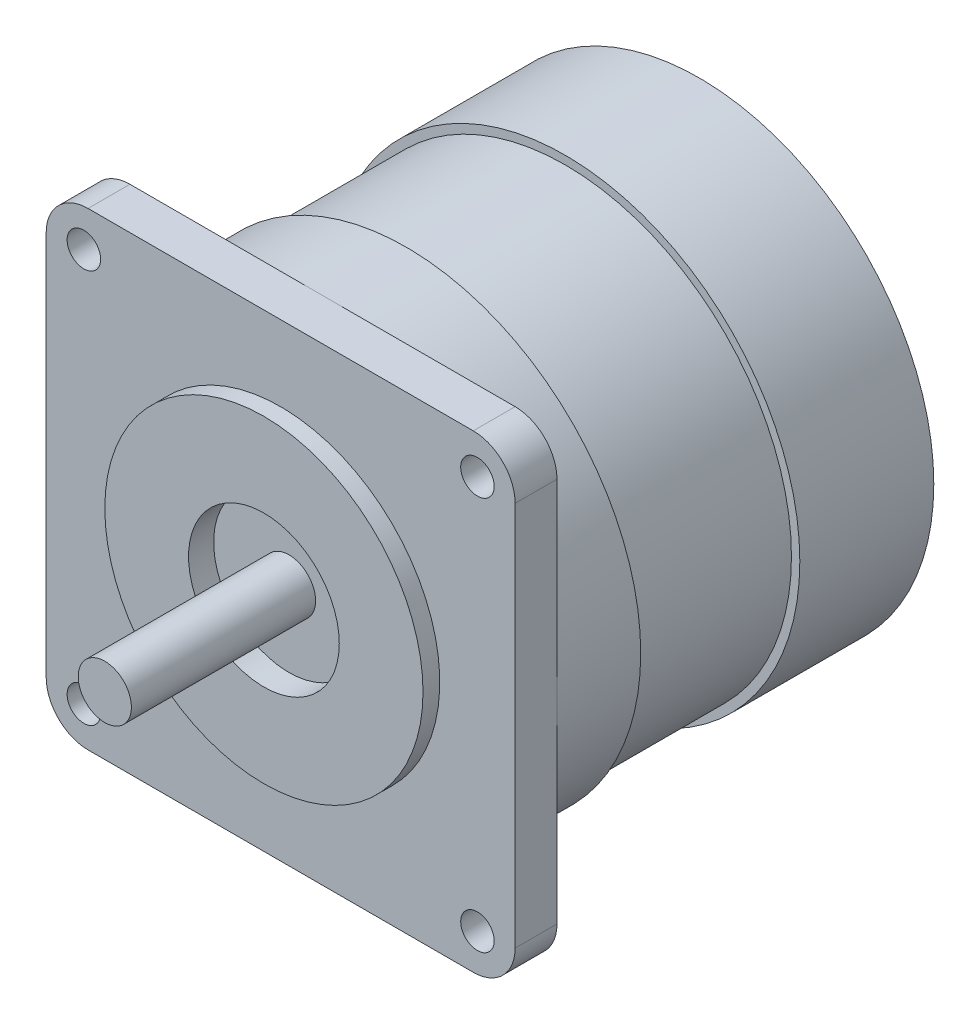
ISO-10303-21;
HEADER;
FILE_DESCRIPTION(('STEP AP214'),'2;1');
FILE_NAME('part.step','',(''),(''),'','','');
FILE_SCHEMA(('AUTOMOTIVE_DESIGN { 1 0 10303 214 1 1 1 1 }'));
ENDSEC;
DATA;
#1=APPLICATION_CONTEXT('core data for automotive mechanical design processes');
#2=APPLICATION_PROTOCOL_DEFINITION('international standard','automotive_design',2000,#1);
#3=PRODUCT_CONTEXT('',#1,'mechanical');
#4=PRODUCT('Part','Part','',(#3));
#5=PRODUCT_RELATED_PRODUCT_CATEGORY('part','',(#4));
#6=PRODUCT_DEFINITION_FORMATION('','',#4);
#7=PRODUCT_DEFINITION_CONTEXT('part definition',#1,'design');
#8=PRODUCT_DEFINITION('design','',#6,#7);
#9=PRODUCT_DEFINITION_SHAPE('','',#8);
#10=(LENGTH_UNIT() NAMED_UNIT(*) SI_UNIT(.MILLI.,.METRE.));
#11=(NAMED_UNIT(*) PLANE_ANGLE_UNIT() SI_UNIT($,.RADIAN.));
#12=(NAMED_UNIT(*) SI_UNIT($,.STERADIAN.) SOLID_ANGLE_UNIT());
#13=UNCERTAINTY_MEASURE_WITH_UNIT(LENGTH_MEASURE(1.E-05),#10,'distance_accuracy_value','');
#14=(GEOMETRIC_REPRESENTATION_CONTEXT(3) GLOBAL_UNCERTAINTY_ASSIGNED_CONTEXT((#13)) GLOBAL_UNIT_ASSIGNED_CONTEXT((#10,
#11,#12)) REPRESENTATION_CONTEXT('',''));
#15=CARTESIAN_POINT('',(0.,0.,0.));
#16=DIRECTION('',(0.,0.,1.));
#17=DIRECTION('',(1.,0.,0.));
#18=AXIS2_PLACEMENT_3D('',#15,#16,#17);
#19=CARTESIAN_POINT('',(0.,0.,4.));
#20=DIRECTION('',(0.,0.,1.));
#21=DIRECTION('',(1.,0.,0.));
#22=AXIS2_PLACEMENT_3D('',#19,#20,#21);
#23=PLANE('',#22);
#24=CARTESIAN_POINT('',(0.,0.,4.));
#25=DIRECTION('',(0.,0.,1.));
#26=DIRECTION('',(1.,0.,0.));
#27=AXIS2_PLACEMENT_3D('',#24,#25,#26);
#28=CIRCLE('',#27,9.);
#29=CARTESIAN_POINT('',(9.,0.,4.));
#30=VERTEX_POINT('',#29);
#31=EDGE_CURVE('E534',#30,#30,#28,.T.);
#32=ORIENTED_EDGE('',*,*,#31,.T.);
#33=EDGE_LOOP('',(#32));
#34=FACE_BOUND('',#33,.T.);
#35=CARTESIAN_POINT('',(0.,0.,4.));
#36=DIRECTION('',(0.,0.,1.));
#37=DIRECTION('',(1.,0.,0.));
#38=AXIS2_PLACEMENT_3D('',#35,#36,#37);
#39=CIRCLE('',#38,3.175);
#40=CARTESIAN_POINT('',(3.175,0.,4.));
#41=VERTEX_POINT('',#40);
#42=EDGE_CURVE('E525',#41,#41,#39,.T.);
#43=ORIENTED_EDGE('',*,*,#42,.F.);
#44=EDGE_LOOP('',(#43));
#45=FACE_BOUND('',#44,.T.);
#46=ADVANCED_FACE('F40',(#34,#45),#23,.T.);
#47=CARTESIAN_POINT('',(0.,0.,5.));
#48=DIRECTION('',(0.,0.,-1.));
#49=DIRECTION('',(-1.,0.,0.));
#50=AXIS2_PLACEMENT_3D('',#47,#48,#49);
#51=PLANE('',#50);
#52=CARTESIAN_POINT('',(-23.5,-23.5,5.));
#53=DIRECTION('',(0.,0.,1.));
#54=DIRECTION('',(1.,0.,0.));
#55=AXIS2_PLACEMENT_3D('',#52,#53,#54);
#56=CIRCLE('',#55,2.);
#57=CARTESIAN_POINT('',(-21.5,-23.5,5.));
#58=VERTEX_POINT('',#57);
#59=EDGE_CURVE('E506',#58,#58,#56,.T.);
#60=ORIENTED_EDGE('',*,*,#59,.F.);
#61=EDGE_LOOP('',(#60));
#62=FACE_BOUND('',#61,.T.);
#63=CARTESIAN_POINT('',(23.5,-23.5,5.));
#64=DIRECTION('',(0.,0.,1.));
#65=DIRECTION('',(-1.,0.,0.));
#66=AXIS2_PLACEMENT_3D('',#63,#64,#65);
#67=CIRCLE('',#66,2.);
#68=CARTESIAN_POINT('',(21.5,-23.5,5.));
#69=VERTEX_POINT('',#68);
#70=EDGE_CURVE('E505',#69,#69,#67,.T.);
#71=ORIENTED_EDGE('',*,*,#70,.F.);
#72=EDGE_LOOP('',(#71));
#73=FACE_BOUND('',#72,.T.);
#74=CARTESIAN_POINT('',(-23.5,23.5,5.));
#75=DIRECTION('',(0.,0.,1.));
#76=DIRECTION('',(-1.,0.,0.));
#77=AXIS2_PLACEMENT_3D('',#74,#75,#76);
#78=CIRCLE('',#77,2.);
#79=CARTESIAN_POINT('',(-25.5,23.5,5.));
#80=VERTEX_POINT('',#79);
#81=EDGE_CURVE('E516',#80,#80,#78,.T.);
#82=ORIENTED_EDGE('',*,*,#81,.F.);
#83=EDGE_LOOP('',(#82));
#84=FACE_BOUND('',#83,.T.);
#85=CARTESIAN_POINT('',(23.5,23.5,5.));
#86=DIRECTION('',(0.,0.,1.));
#87=DIRECTION('',(1.,0.,0.));
#88=AXIS2_PLACEMENT_3D('',#85,#86,#87);
#89=CIRCLE('',#88,2.);
#90=CARTESIAN_POINT('',(25.5,23.5,5.));
#91=VERTEX_POINT('',#90);
#92=EDGE_CURVE('E522',#91,#91,#89,.T.);
#93=ORIENTED_EDGE('',*,*,#92,.F.);
#94=EDGE_LOOP('',(#93));
#95=FACE_BOUND('',#94,.T.);
#96=DIRECTION('',(0.,-1.,0.));
#97=VECTOR('',#96,1.);
#98=CARTESIAN_POINT('',(-28.,-28.,5.));
#99=LINE('',#98,#97);
#100=CARTESIAN_POINT('',(-28.,23.,5.));
#101=VERTEX_POINT('',#100);
#102=CARTESIAN_POINT('',(-28.,-23.,5.));
#103=VERTEX_POINT('',#102);
#104=EDGE_CURVE('E124',#101,#103,#99,.T.);
#105=ORIENTED_EDGE('',*,*,#104,.T.);
#106=CARTESIAN_POINT('',(-23.,-23.,5.));
#107=DIRECTION('',(0.,0.,-1.));
#108=DIRECTION('',(-1.,0.,0.));
#109=AXIS2_PLACEMENT_3D('',#106,#107,#108);
#110=CIRCLE('',#109,5.);
#111=CARTESIAN_POINT('',(-23.,-28.,5.));
#112=VERTEX_POINT('',#111);
#113=EDGE_CURVE('E172',#103,#112,#110,.F.);
#114=ORIENTED_EDGE('',*,*,#113,.T.);
#115=DIRECTION('',(1.,0.,0.));
#116=VECTOR('',#115,1.);
#117=CARTESIAN_POINT('',(-28.,-28.,5.));
#118=LINE('',#117,#116);
#119=CARTESIAN_POINT('',(23.,-28.,5.));
#120=VERTEX_POINT('',#119);
#121=EDGE_CURVE('E200',#112,#120,#118,.T.);
#122=ORIENTED_EDGE('',*,*,#121,.T.);
#123=CARTESIAN_POINT('',(23.,-23.,5.));
#124=DIRECTION('',(0.,0.,-1.));
#125=DIRECTION('',(-1.,0.,0.));
#126=AXIS2_PLACEMENT_3D('',#123,#124,#125);
#127=CIRCLE('',#126,5.);
#128=CARTESIAN_POINT('',(28.,-23.,5.));
#129=VERTEX_POINT('',#128);
#130=EDGE_CURVE('E170',#120,#129,#127,.F.);
#131=ORIENTED_EDGE('',*,*,#130,.T.);
#132=DIRECTION('',(0.,1.,0.));
#133=VECTOR('',#132,1.);
#134=CARTESIAN_POINT('',(28.,-28.,5.));
#135=LINE('',#134,#133);
#136=CARTESIAN_POINT('',(28.,23.,5.));
#137=VERTEX_POINT('',#136);
#138=EDGE_CURVE('E198',#129,#137,#135,.T.);
#139=ORIENTED_EDGE('',*,*,#138,.T.);
#140=CARTESIAN_POINT('',(23.,23.,5.));
#141=DIRECTION('',(0.,0.,-1.));
#142=DIRECTION('',(-1.,0.,0.));
#143=AXIS2_PLACEMENT_3D('',#140,#141,#142);
#144=CIRCLE('',#143,5.);
#145=CARTESIAN_POINT('',(23.,28.,5.));
#146=VERTEX_POINT('',#145);
#147=EDGE_CURVE('E168',#137,#146,#144,.F.);
#148=ORIENTED_EDGE('',*,*,#147,.T.);
#149=DIRECTION('',(-1.,0.,0.));
#150=VECTOR('',#149,1.);
#151=CARTESIAN_POINT('',(-28.,28.,5.));
#152=LINE('',#151,#150);
#153=CARTESIAN_POINT('',(-23.,28.,5.));
#154=VERTEX_POINT('',#153);
#155=EDGE_CURVE('E196',#146,#154,#152,.T.);
#156=ORIENTED_EDGE('',*,*,#155,.T.);
#157=CARTESIAN_POINT('',(-23.,23.,5.));
#158=DIRECTION('',(0.,0.,-1.));
#159=DIRECTION('',(-1.,0.,0.));
#160=AXIS2_PLACEMENT_3D('',#157,#158,#159);
#161=CIRCLE('',#160,5.);
#162=EDGE_CURVE('E166',#154,#101,#161,.F.);
#163=ORIENTED_EDGE('',*,*,#162,.T.);
#164=EDGE_LOOP('',(#105,#114,#122,#131,#139,#148,#156,#163));
#165=FACE_BOUND('',#164,.T.);
#166=CARTESIAN_POINT('',(0.,0.,5.));
#167=DIRECTION('',(0.,0.,-1.));
#168=DIRECTION('',(-1.,0.,0.));
#169=AXIS2_PLACEMENT_3D('',#166,#167,#168);
#170=CIRCLE('',#169,19.);
#171=CARTESIAN_POINT('',(-19.,0.,5.));
#172=VERTEX_POINT('',#171);
#173=EDGE_CURVE('E138',#172,#172,#170,.F.);
#174=ORIENTED_EDGE('',*,*,#173,.F.);
#175=EDGE_LOOP('',(#174));
#176=FACE_BOUND('',#175,.T.);
#177=ADVANCED_FACE('F194',(#62,#73,#84,#95,#165,#176),#51,.F.);
#178=CARTESIAN_POINT('',(0.,0.,0.));
#179=DIRECTION('',(0.,0.,-1.));
#180=DIRECTION('',(-1.,0.,0.));
#181=AXIS2_PLACEMENT_3D('',#178,#179,#180);
#182=PLANE('',#181);
#183=CARTESIAN_POINT('',(23.5,23.5,0.));
#184=DIRECTION('',(0.,0.,-1.));
#185=DIRECTION('',(-1.,0.,0.));
#186=AXIS2_PLACEMENT_3D('',#183,#184,#185);
#187=CIRCLE('',#186,2.);
#188=CARTESIAN_POINT('',(21.5,23.5,0.));
#189=VERTEX_POINT('',#188);
#190=EDGE_CURVE('E519',#189,#189,#187,.F.);
#191=ORIENTED_EDGE('',*,*,#190,.T.);
#192=EDGE_LOOP('',(#191));
#193=FACE_BOUND('',#192,.T.);
#194=DIRECTION('',(-1.,0.,0.));
#195=VECTOR('',#194,1.);
#196=CARTESIAN_POINT('',(-28.,28.,0.));
#197=LINE('',#196,#195);
#198=CARTESIAN_POINT('',(23.,28.,0.));
#199=VERTEX_POINT('',#198);
#200=CARTESIAN_POINT('',(0.,28.,0.));
#201=VERTEX_POINT('',#200);
#202=EDGE_CURVE('E115',#199,#201,#197,.T.);
#203=ORIENTED_EDGE('',*,*,#202,.F.);
#204=CARTESIAN_POINT('',(23.,23.,0.));
#205=DIRECTION('',(0.,0.,-1.));
#206=DIRECTION('',(-1.,0.,0.));
#207=AXIS2_PLACEMENT_3D('',#204,#205,#206);
#208=CIRCLE('',#207,5.);
#209=CARTESIAN_POINT('',(28.,23.,0.));
#210=VERTEX_POINT('',#209);
#211=EDGE_CURVE('E48',#199,#210,#208,.T.);
#212=ORIENTED_EDGE('',*,*,#211,.T.);
#213=DIRECTION('',(0.,1.,0.));
#214=VECTOR('',#213,1.);
#215=CARTESIAN_POINT('',(28.,-28.,0.));
#216=LINE('',#215,#214);
#217=CARTESIAN_POINT('',(28.,0.,0.));
#218=VERTEX_POINT('',#217);
#219=EDGE_CURVE('E143',#218,#210,#216,.T.);
#220=ORIENTED_EDGE('',*,*,#219,.F.);
#221=CARTESIAN_POINT('',(0.,0.,0.));
#222=DIRECTION('',(0.,0.,1.));
#223=DIRECTION('',(1.,0.,0.));
#224=AXIS2_PLACEMENT_3D('',#221,#222,#223);
#225=CIRCLE('',#224,28.);
#226=EDGE_CURVE('E133',#218,#201,#225,.T.);
#227=ORIENTED_EDGE('',*,*,#226,.T.);
#228=EDGE_LOOP('',(#203,#212,#220,#227));
#229=FACE_BOUND('',#228,.T.);
#230=ADVANCED_FACE('F141',(#193,#229),#182,.T.);
#231=CARTESIAN_POINT('',(-23.5,23.5,0.));
#232=DIRECTION('',(0.,0.,-1.));
#233=DIRECTION('',(-1.,0.,0.));
#234=AXIS2_PLACEMENT_3D('',#231,#232,#233);
#235=CIRCLE('',#234,2.);
#236=CARTESIAN_POINT('',(-25.5,23.5,0.));
#237=VERTEX_POINT('',#236);
#238=EDGE_CURVE('E509',#237,#237,#235,.F.);
#239=ORIENTED_EDGE('',*,*,#238,.T.);
#240=EDGE_LOOP('',(#239));
#241=FACE_BOUND('',#240,.T.);
#242=DIRECTION('',(0.,-1.,0.));
#243=VECTOR('',#242,1.);
#244=CARTESIAN_POINT('',(-28.,-28.,0.));
#245=LINE('',#244,#243);
#246=CARTESIAN_POINT('',(-28.,23.,0.));
#247=VERTEX_POINT('',#246);
#248=CARTESIAN_POINT('',(-28.,0.,0.));
#249=VERTEX_POINT('',#248);
#250=EDGE_CURVE('E204',#247,#249,#245,.T.);
#251=ORIENTED_EDGE('',*,*,#250,.F.);
#252=CARTESIAN_POINT('',(-23.,23.,0.));
#253=DIRECTION('',(0.,0.,-1.));
#254=DIRECTION('',(-1.,0.,0.));
#255=AXIS2_PLACEMENT_3D('',#252,#253,#254);
#256=CIRCLE('',#255,5.);
#257=CARTESIAN_POINT('',(-23.,28.,0.));
#258=VERTEX_POINT('',#257);
#259=EDGE_CURVE('E11',#247,#258,#256,.T.);
#260=ORIENTED_EDGE('',*,*,#259,.T.);
#261=EDGE_CURVE('E119',#201,#258,#197,.T.);
#262=ORIENTED_EDGE('',*,*,#261,.F.);
#263=EDGE_CURVE('E130',#201,#249,#225,.T.);
#264=ORIENTED_EDGE('',*,*,#263,.T.);
#265=EDGE_LOOP('',(#251,#260,#262,#264));
#266=FACE_BOUND('',#265,.T.);
#267=ADVANCED_FACE('F147',(#241,#266),#182,.T.);
#268=CARTESIAN_POINT('',(-23.5,-23.5,0.));
#269=DIRECTION('',(0.,0.,-1.));
#270=DIRECTION('',(-1.,0.,0.));
#271=AXIS2_PLACEMENT_3D('',#268,#269,#270);
#272=CIRCLE('',#271,2.);
#273=CARTESIAN_POINT('',(-25.5,-23.5,0.));
#274=VERTEX_POINT('',#273);
#275=EDGE_CURVE('E512',#274,#274,#272,.F.);
#276=ORIENTED_EDGE('',*,*,#275,.T.);
#277=EDGE_LOOP('',(#276));
#278=FACE_BOUND('',#277,.T.);
#279=DIRECTION('',(1.,0.,0.));
#280=VECTOR('',#279,1.);
#281=CARTESIAN_POINT('',(-28.,-28.,0.));
#282=LINE('',#281,#280);
#283=CARTESIAN_POINT('',(-23.,-28.,0.));
#284=VERTEX_POINT('',#283);
#285=CARTESIAN_POINT('',(0.,-28.,0.));
#286=VERTEX_POINT('',#285);
#287=EDGE_CURVE('E188',#284,#286,#282,.T.);
#288=ORIENTED_EDGE('',*,*,#287,.F.);
#289=CARTESIAN_POINT('',(-23.,-23.,0.));
#290=DIRECTION('',(0.,0.,-1.));
#291=DIRECTION('',(-1.,0.,0.));
#292=AXIS2_PLACEMENT_3D('',#289,#290,#291);
#293=CIRCLE('',#292,5.);
#294=CARTESIAN_POINT('',(-28.,-23.,0.));
#295=VERTEX_POINT('',#294);
#296=EDGE_CURVE('E159',#284,#295,#293,.T.);
#297=ORIENTED_EDGE('',*,*,#296,.T.);
#298=EDGE_CURVE('E144',#249,#295,#245,.T.);
#299=ORIENTED_EDGE('',*,*,#298,.F.);
#300=EDGE_CURVE('E136',#249,#286,#225,.T.);
#301=ORIENTED_EDGE('',*,*,#300,.T.);
#302=EDGE_LOOP('',(#288,#297,#299,#301));
#303=FACE_BOUND('',#302,.T.);
#304=ADVANCED_FACE('F221',(#278,#303),#182,.T.);
#305=CARTESIAN_POINT('',(23.5,-23.5,0.));
#306=DIRECTION('',(0.,0.,-1.));
#307=DIRECTION('',(-1.,0.,0.));
#308=AXIS2_PLACEMENT_3D('',#305,#306,#307);
#309=CIRCLE('',#308,2.);
#310=CARTESIAN_POINT('',(21.5,-23.5,0.));
#311=VERTEX_POINT('',#310);
#312=EDGE_CURVE('E504',#311,#311,#309,.F.);
#313=ORIENTED_EDGE('',*,*,#312,.T.);
#314=EDGE_LOOP('',(#313));
#315=FACE_BOUND('',#314,.T.);
#316=CARTESIAN_POINT('',(28.,-23.,0.));
#317=VERTEX_POINT('',#316);
#318=EDGE_CURVE('E148',#317,#218,#216,.T.);
#319=ORIENTED_EDGE('',*,*,#318,.F.);
#320=CARTESIAN_POINT('',(23.,-23.,0.));
#321=DIRECTION('',(0.,0.,-1.));
#322=DIRECTION('',(-1.,0.,0.));
#323=AXIS2_PLACEMENT_3D('',#320,#321,#322);
#324=CIRCLE('',#323,5.);
#325=CARTESIAN_POINT('',(23.,-28.,0.));
#326=VERTEX_POINT('',#325);
#327=EDGE_CURVE('E179',#317,#326,#324,.T.);
#328=ORIENTED_EDGE('',*,*,#327,.T.);
#329=EDGE_CURVE('E205',#286,#326,#282,.T.);
#330=ORIENTED_EDGE('',*,*,#329,.F.);
#331=EDGE_CURVE('E146',#286,#218,#225,.T.);
#332=ORIENTED_EDGE('',*,*,#331,.T.);
#333=EDGE_LOOP('',(#319,#328,#330,#332));
#334=FACE_BOUND('',#333,.T.);
#335=ADVANCED_FACE('F219',(#315,#334),#182,.T.);
#336=CARTESIAN_POINT('',(-28.,-28.,5.));
#337=DIRECTION('',(1.,0.,0.));
#338=DIRECTION('',(0.,0.,-1.));
#339=AXIS2_PLACEMENT_3D('',#336,#337,#338);
#340=PLANE('',#339);
#341=ORIENTED_EDGE('',*,*,#298,.T.);
#342=DIRECTION('',(0.,0.,-1.));
#343=VECTOR('',#342,1.);
#344=CARTESIAN_POINT('',(-28.,-23.,5.));
#345=LINE('',#344,#343);
#346=EDGE_CURVE('E164',#295,#103,#345,.F.);
#347=ORIENTED_EDGE('',*,*,#346,.T.);
#348=ORIENTED_EDGE('',*,*,#104,.F.);
#349=DIRECTION('',(0.,0.,-1.));
#350=VECTOR('',#349,1.);
#351=CARTESIAN_POINT('',(-28.,23.,5.));
#352=LINE('',#351,#350);
#353=EDGE_CURVE('E161',#101,#247,#352,.T.);
#354=ORIENTED_EDGE('',*,*,#353,.T.);
#355=ORIENTED_EDGE('',*,*,#250,.T.);
#356=EDGE_LOOP('',(#341,#347,#348,#354,#355));
#357=FACE_BOUND('',#356,.T.);
#358=ADVANCED_FACE('F234',(#357),#340,.F.);
#359=CARTESIAN_POINT('',(-28.,-28.,5.));
#360=DIRECTION('',(0.,1.,0.));
#361=DIRECTION('',(-1.,0.,0.));
#362=AXIS2_PLACEMENT_3D('',#359,#360,#361);
#363=PLANE('',#362);
#364=ORIENTED_EDGE('',*,*,#121,.F.);
#365=DIRECTION('',(0.,0.,-1.));
#366=VECTOR('',#365,1.);
#367=CARTESIAN_POINT('',(-23.,-28.,5.));
#368=LINE('',#367,#366);
#369=EDGE_CURVE('E156',#112,#284,#368,.T.);
#370=ORIENTED_EDGE('',*,*,#369,.T.);
#371=ORIENTED_EDGE('',*,*,#287,.T.);
#372=ORIENTED_EDGE('',*,*,#329,.T.);
#373=DIRECTION('',(0.,0.,-1.));
#374=VECTOR('',#373,1.);
#375=CARTESIAN_POINT('',(23.,-28.,5.));
#376=LINE('',#375,#374);
#377=EDGE_CURVE('E154',#326,#120,#376,.F.);
#378=ORIENTED_EDGE('',*,*,#377,.T.);
#379=EDGE_LOOP('',(#364,#370,#371,#372,#378));
#380=FACE_BOUND('',#379,.T.);
#381=ADVANCED_FACE('F212',(#380),#363,.F.);
#382=CARTESIAN_POINT('',(28.,-28.,5.));
#383=DIRECTION('',(-1.,0.,0.));
#384=DIRECTION('',(0.,0.,1.));
#385=AXIS2_PLACEMENT_3D('',#382,#383,#384);
#386=PLANE('',#385);
#387=ORIENTED_EDGE('',*,*,#138,.F.);
#388=DIRECTION('',(0.,0.,-1.));
#389=VECTOR('',#388,1.);
#390=CARTESIAN_POINT('',(28.,-23.,5.));
#391=LINE('',#390,#389);
#392=EDGE_CURVE('E176',#129,#317,#391,.T.);
#393=ORIENTED_EDGE('',*,*,#392,.T.);
#394=ORIENTED_EDGE('',*,*,#318,.T.);
#395=ORIENTED_EDGE('',*,*,#219,.T.);
#396=DIRECTION('',(0.,0.,-1.));
#397=VECTOR('',#396,1.);
#398=CARTESIAN_POINT('',(28.,23.,5.));
#399=LINE('',#398,#397);
#400=EDGE_CURVE('E174',#210,#137,#399,.F.);
#401=ORIENTED_EDGE('',*,*,#400,.T.);
#402=EDGE_LOOP('',(#387,#393,#394,#395,#401));
#403=FACE_BOUND('',#402,.T.);
#404=ADVANCED_FACE('F185',(#403),#386,.F.);
#405=CARTESIAN_POINT('',(-28.,28.,5.));
#406=DIRECTION('',(0.,-1.,0.));
#407=DIRECTION('',(0.,0.,-1.));
#408=AXIS2_PLACEMENT_3D('',#405,#406,#407);
#409=PLANE('',#408);
#410=ORIENTED_EDGE('',*,*,#155,.F.);
#411=DIRECTION('',(0.,0.,-1.));
#412=VECTOR('',#411,1.);
#413=CARTESIAN_POINT('',(23.,28.,5.));
#414=LINE('',#413,#412);
#415=EDGE_CURVE('E121',#146,#199,#414,.T.);
#416=ORIENTED_EDGE('',*,*,#415,.T.);
#417=ORIENTED_EDGE('',*,*,#202,.T.);
#418=ORIENTED_EDGE('',*,*,#261,.T.);
#419=DIRECTION('',(0.,0.,-1.));
#420=VECTOR('',#419,1.);
#421=CARTESIAN_POINT('',(-23.,28.,5.));
#422=LINE('',#421,#420);
#423=EDGE_CURVE('E181',#258,#154,#422,.F.);
#424=ORIENTED_EDGE('',*,*,#423,.T.);
#425=EDGE_LOOP('',(#410,#416,#417,#418,#424));
#426=FACE_BOUND('',#425,.T.);
#427=ADVANCED_FACE('F118',(#426),#409,.F.);
#428=CARTESIAN_POINT('',(0.,0.,0.));
#429=DIRECTION('',(0.,0.,1.));
#430=DIRECTION('',(1.,0.,0.));
#431=AXIS2_PLACEMENT_3D('',#428,#429,#430);
#432=CYLINDRICAL_SURFACE('',#431,28.);
#433=CARTESIAN_POINT('',(0.,0.,-10.));
#434=DIRECTION('',(0.,0.,1.));
#435=DIRECTION('',(1.,0.,0.));
#436=AXIS2_PLACEMENT_3D('',#433,#434,#435);
#437=CIRCLE('',#436,28.);
#438=CARTESIAN_POINT('',(28.,0.,-10.));
#439=VERTEX_POINT('',#438);
#440=EDGE_CURVE('E145',#439,#439,#437,.T.);
#441=ORIENTED_EDGE('',*,*,#440,.T.);
#442=EDGE_LOOP('',(#441));
#443=FACE_BOUND('',#442,.T.);
#444=ORIENTED_EDGE('',*,*,#226,.F.);
#445=ORIENTED_EDGE('',*,*,#331,.F.);
#446=ORIENTED_EDGE('',*,*,#300,.F.);
#447=ORIENTED_EDGE('',*,*,#263,.F.);
#448=EDGE_LOOP('',(#444,#445,#446,#447));
#449=FACE_BOUND('',#448,.T.);
#450=ADVANCED_FACE('F131',(#443,#449),#432,.T.);
#451=CARTESIAN_POINT('',(28.,0.,-10.));
#452=DIRECTION('',(0.,0.,-1.));
#453=DIRECTION('',(-1.,0.,0.));
#454=AXIS2_PLACEMENT_3D('',#451,#452,#453);
#455=PLANE('',#454);
#456=CARTESIAN_POINT('',(0.,0.,-10.));
#457=DIRECTION('',(0.,0.,1.));
#458=DIRECTION('',(1.,0.,0.));
#459=AXIS2_PLACEMENT_3D('',#456,#457,#458);
#460=CIRCLE('',#459,27.);
#461=CARTESIAN_POINT('',(27.,0.,-10.));
#462=VERTEX_POINT('',#461);
#463=EDGE_CURVE('E549',#462,#462,#460,.T.);
#464=ORIENTED_EDGE('',*,*,#463,.T.);
#465=EDGE_LOOP('',(#464));
#466=FACE_BOUND('',#465,.T.);
#467=ORIENTED_EDGE('',*,*,#440,.F.);
#468=EDGE_LOOP('',(#467));
#469=FACE_BOUND('',#468,.T.);
#470=ADVANCED_FACE('F281',(#466,#469),#455,.T.);
#471=CARTESIAN_POINT('',(0.,0.,0.));
#472=DIRECTION('',(0.,0.,1.));
#473=DIRECTION('',(1.,0.,0.));
#474=AXIS2_PLACEMENT_3D('',#471,#472,#473);
#475=CYLINDRICAL_SURFACE('',#474,27.);
#476=CARTESIAN_POINT('',(0.,0.,-29.));
#477=DIRECTION('',(0.,0.,1.));
#478=DIRECTION('',(1.,0.,0.));
#479=AXIS2_PLACEMENT_3D('',#476,#477,#478);
#480=CIRCLE('',#479,27.);
#481=CARTESIAN_POINT('',(27.,0.,-29.));
#482=VERTEX_POINT('',#481);
#483=EDGE_CURVE('E547',#482,#482,#480,.T.);
#484=ORIENTED_EDGE('',*,*,#483,.T.);
#485=EDGE_LOOP('',(#484));
#486=FACE_BOUND('',#485,.T.);
#487=ORIENTED_EDGE('',*,*,#463,.F.);
#488=EDGE_LOOP('',(#487));
#489=FACE_BOUND('',#488,.T.);
#490=ADVANCED_FACE('F277',(#486,#489),#475,.T.);
#491=CARTESIAN_POINT('',(27.,0.,-29.));
#492=DIRECTION('',(0.,0.,1.));
#493=DIRECTION('',(1.,0.,0.));
#494=AXIS2_PLACEMENT_3D('',#491,#492,#493);
#495=PLANE('',#494);
#496=CARTESIAN_POINT('',(0.,0.,-29.));
#497=DIRECTION('',(0.,0.,1.));
#498=DIRECTION('',(1.,0.,0.));
#499=AXIS2_PLACEMENT_3D('',#496,#497,#498);
#500=CIRCLE('',#499,28.);
#501=CARTESIAN_POINT('',(28.,0.,-29.));
#502=VERTEX_POINT('',#501);
#503=EDGE_CURVE('E544',#502,#502,#500,.T.);
#504=ORIENTED_EDGE('',*,*,#503,.T.);
#505=EDGE_LOOP('',(#504));
#506=FACE_BOUND('',#505,.T.);
#507=ORIENTED_EDGE('',*,*,#483,.F.);
#508=EDGE_LOOP('',(#507));
#509=FACE_BOUND('',#508,.T.);
#510=ADVANCED_FACE('F273',(#506,#509),#495,.T.);
#511=CARTESIAN_POINT('',(0.,0.,0.));
#512=DIRECTION('',(0.,0.,1.));
#513=DIRECTION('',(1.,0.,0.));
#514=AXIS2_PLACEMENT_3D('',#511,#512,#513);
#515=CYLINDRICAL_SURFACE('',#514,28.);
#516=CARTESIAN_POINT('',(0.,0.,-45.));
#517=DIRECTION('',(0.,0.,1.));
#518=DIRECTION('',(1.,0.,0.));
#519=AXIS2_PLACEMENT_3D('',#516,#517,#518);
#520=CIRCLE('',#519,28.);
#521=CARTESIAN_POINT('',(28.,0.,-45.));
#522=VERTEX_POINT('',#521);
#523=EDGE_CURVE('E541',#522,#522,#520,.T.);
#524=ORIENTED_EDGE('',*,*,#523,.T.);
#525=EDGE_LOOP('',(#524));
#526=FACE_BOUND('',#525,.T.);
#527=ORIENTED_EDGE('',*,*,#503,.F.);
#528=EDGE_LOOP('',(#527));
#529=FACE_BOUND('',#528,.T.);
#530=ADVANCED_FACE('F269',(#526,#529),#515,.T.);
#531=CARTESIAN_POINT('',(28.,0.,-45.));
#532=DIRECTION('',(0.,0.,-1.));
#533=DIRECTION('',(-1.,0.,0.));
#534=AXIS2_PLACEMENT_3D('',#531,#532,#533);
#535=PLANE('',#534);
#536=ORIENTED_EDGE('',*,*,#523,.F.);
#537=EDGE_LOOP('',(#536));
#538=FACE_BOUND('',#537,.T.);
#539=ADVANCED_FACE('F265',(#538),#535,.T.);
#540=CARTESIAN_POINT('',(0.,0.,7.));
#541=DIRECTION('',(0.,0.,-1.));
#542=DIRECTION('',(-1.,0.,0.));
#543=AXIS2_PLACEMENT_3D('',#540,#541,#542);
#544=CYLINDRICAL_SURFACE('',#543,19.);
#545=CARTESIAN_POINT('',(0.,0.,7.));
#546=DIRECTION('',(0.,0.,1.));
#547=DIRECTION('',(1.,0.,0.));
#548=AXIS2_PLACEMENT_3D('',#545,#546,#547);
#549=CIRCLE('',#548,19.);
#550=CARTESIAN_POINT('',(19.,0.,7.));
#551=VERTEX_POINT('',#550);
#552=EDGE_CURVE('E536',#551,#551,#549,.T.);
#553=ORIENTED_EDGE('',*,*,#552,.F.);
#554=EDGE_LOOP('',(#553));
#555=FACE_BOUND('',#554,.T.);
#556=ORIENTED_EDGE('',*,*,#173,.T.);
#557=EDGE_LOOP('',(#556));
#558=FACE_BOUND('',#557,.T.);
#559=ADVANCED_FACE('F261',(#555,#558),#544,.T.);
#560=CARTESIAN_POINT('',(0.,0.,7.));
#561=DIRECTION('',(0.,0.,1.));
#562=DIRECTION('',(1.,0.,0.));
#563=AXIS2_PLACEMENT_3D('',#560,#561,#562);
#564=PLANE('',#563);
#565=CARTESIAN_POINT('',(0.,0.,7.));
#566=DIRECTION('',(0.,0.,1.));
#567=DIRECTION('',(1.,0.,0.));
#568=AXIS2_PLACEMENT_3D('',#565,#566,#567);
#569=CIRCLE('',#568,9.);
#570=CARTESIAN_POINT('',(9.,0.,7.));
#571=VERTEX_POINT('',#570);
#572=EDGE_CURVE('E531',#571,#571,#569,.T.);
#573=ORIENTED_EDGE('',*,*,#572,.F.);
#574=EDGE_LOOP('',(#573));
#575=FACE_BOUND('',#574,.T.);
#576=ORIENTED_EDGE('',*,*,#552,.T.);
#577=EDGE_LOOP('',(#576));
#578=FACE_BOUND('',#577,.T.);
#579=ADVANCED_FACE('F257',(#575,#578),#564,.T.);
#580=CARTESIAN_POINT('',(0.,0.,4.));
#581=DIRECTION('',(0.,0.,1.));
#582=DIRECTION('',(1.,0.,0.));
#583=AXIS2_PLACEMENT_3D('',#580,#581,#582);
#584=CYLINDRICAL_SURFACE('',#583,9.);
#585=ORIENTED_EDGE('',*,*,#31,.F.);
#586=EDGE_LOOP('',(#585));
#587=FACE_BOUND('',#586,.T.);
#588=ORIENTED_EDGE('',*,*,#572,.T.);
#589=EDGE_LOOP('',(#588));
#590=FACE_BOUND('',#589,.T.);
#591=ADVANCED_FACE('F254',(#587,#590),#584,.F.);
#592=CARTESIAN_POINT('',(0.,0.,26.));
#593=DIRECTION('',(0.,0.,-1.));
#594=DIRECTION('',(-1.,0.,0.));
#595=AXIS2_PLACEMENT_3D('',#592,#593,#594);
#596=CYLINDRICAL_SURFACE('',#595,3.175);
#597=CARTESIAN_POINT('',(0.,0.,26.));
#598=DIRECTION('',(0.,0.,1.));
#599=DIRECTION('',(1.,0.,0.));
#600=AXIS2_PLACEMENT_3D('',#597,#598,#599);
#601=CIRCLE('',#600,3.175);
#602=CARTESIAN_POINT('',(3.175,0.,26.));
#603=VERTEX_POINT('',#602);
#604=EDGE_CURVE('E528',#603,#603,#601,.T.);
#605=ORIENTED_EDGE('',*,*,#604,.F.);
#606=EDGE_LOOP('',(#605));
#607=FACE_BOUND('',#606,.T.);
#608=ORIENTED_EDGE('',*,*,#42,.T.);
#609=EDGE_LOOP('',(#608));
#610=FACE_BOUND('',#609,.T.);
#611=ADVANCED_FACE('F252',(#607,#610),#596,.T.);
#612=CARTESIAN_POINT('',(0.,0.,26.));
#613=DIRECTION('',(0.,0.,1.));
#614=DIRECTION('',(1.,0.,0.));
#615=AXIS2_PLACEMENT_3D('',#612,#613,#614);
#616=PLANE('',#615);
#617=ORIENTED_EDGE('',*,*,#604,.T.);
#618=EDGE_LOOP('',(#617));
#619=FACE_BOUND('',#618,.T.);
#620=ADVANCED_FACE('F361',(#619),#616,.T.);
#621=CARTESIAN_POINT('',(23.5,23.5,-45.001));
#622=DIRECTION('',(0.,0.,1.));
#623=DIRECTION('',(1.,0.,0.));
#624=AXIS2_PLACEMENT_3D('',#621,#622,#623);
#625=CYLINDRICAL_SURFACE('',#624,2.);
#626=ORIENTED_EDGE('',*,*,#190,.F.);
#627=EDGE_LOOP('',(#626));
#628=FACE_BOUND('',#627,.T.);
#629=ORIENTED_EDGE('',*,*,#92,.T.);
#630=EDGE_LOOP('',(#629));
#631=FACE_BOUND('',#630,.T.);
#632=ADVANCED_FACE('F352',(#628,#631),#625,.F.);
#633=CARTESIAN_POINT('',(-23.5,23.5,-45.001));
#634=DIRECTION('',(0.,0.,1.));
#635=DIRECTION('',(1.,0.,0.));
#636=AXIS2_PLACEMENT_3D('',#633,#634,#635);
#637=CYLINDRICAL_SURFACE('',#636,2.);
#638=ORIENTED_EDGE('',*,*,#238,.F.);
#639=EDGE_LOOP('',(#638));
#640=FACE_BOUND('',#639,.T.);
#641=ORIENTED_EDGE('',*,*,#81,.T.);
#642=EDGE_LOOP('',(#641));
#643=FACE_BOUND('',#642,.T.);
#644=ADVANCED_FACE('F343',(#640,#643),#637,.F.);
#645=CARTESIAN_POINT('',(23.5,-23.5,-45.001));
#646=DIRECTION('',(0.,0.,1.));
#647=DIRECTION('',(1.,0.,0.));
#648=AXIS2_PLACEMENT_3D('',#645,#646,#647);
#649=CYLINDRICAL_SURFACE('',#648,2.);
#650=ORIENTED_EDGE('',*,*,#312,.F.);
#651=EDGE_LOOP('',(#650));
#652=FACE_BOUND('',#651,.T.);
#653=ORIENTED_EDGE('',*,*,#70,.T.);
#654=EDGE_LOOP('',(#653));
#655=FACE_BOUND('',#654,.T.);
#656=ADVANCED_FACE('F333',(#652,#655),#649,.F.);
#657=CARTESIAN_POINT('',(-23.5,-23.5,-45.001));
#658=DIRECTION('',(0.,0.,1.));
#659=DIRECTION('',(1.,0.,0.));
#660=AXIS2_PLACEMENT_3D('',#657,#658,#659);
#661=CYLINDRICAL_SURFACE('',#660,2.);
#662=ORIENTED_EDGE('',*,*,#275,.F.);
#663=EDGE_LOOP('',(#662));
#664=FACE_BOUND('',#663,.T.);
#665=ORIENTED_EDGE('',*,*,#59,.T.);
#666=EDGE_LOOP('',(#665));
#667=FACE_BOUND('',#666,.T.);
#668=ADVANCED_FACE('F302',(#664,#667),#661,.F.);
#669=CARTESIAN_POINT('',(-23.,-23.,5.));
#670=DIRECTION('',(0.,0.,-1.));
#671=DIRECTION('',(-1.,0.,0.));
#672=AXIS2_PLACEMENT_3D('',#669,#670,#671);
#673=CYLINDRICAL_SURFACE('',#672,5.);
#674=ORIENTED_EDGE('',*,*,#113,.F.);
#675=ORIENTED_EDGE('',*,*,#346,.F.);
#676=ORIENTED_EDGE('',*,*,#296,.F.);
#677=ORIENTED_EDGE('',*,*,#369,.F.);
#678=EDGE_LOOP('',(#674,#675,#676,#677));
#679=FACE_BOUND('',#678,.T.);
#680=ADVANCED_FACE('F233',(#679),#673,.T.);
#681=CARTESIAN_POINT('',(23.,-23.,5.));
#682=DIRECTION('',(0.,0.,-1.));
#683=DIRECTION('',(-1.,0.,0.));
#684=AXIS2_PLACEMENT_3D('',#681,#682,#683);
#685=CYLINDRICAL_SURFACE('',#684,5.);
#686=ORIENTED_EDGE('',*,*,#130,.F.);
#687=ORIENTED_EDGE('',*,*,#377,.F.);
#688=ORIENTED_EDGE('',*,*,#327,.F.);
#689=ORIENTED_EDGE('',*,*,#392,.F.);
#690=EDGE_LOOP('',(#686,#687,#688,#689));
#691=FACE_BOUND('',#690,.T.);
#692=ADVANCED_FACE('F217',(#691),#685,.T.);
#693=CARTESIAN_POINT('',(23.,23.,5.));
#694=DIRECTION('',(0.,0.,-1.));
#695=DIRECTION('',(-1.,0.,0.));
#696=AXIS2_PLACEMENT_3D('',#693,#694,#695);
#697=CYLINDRICAL_SURFACE('',#696,5.);
#698=ORIENTED_EDGE('',*,*,#147,.F.);
#699=ORIENTED_EDGE('',*,*,#400,.F.);
#700=ORIENTED_EDGE('',*,*,#211,.F.);
#701=ORIENTED_EDGE('',*,*,#415,.F.);
#702=EDGE_LOOP('',(#698,#699,#700,#701));
#703=FACE_BOUND('',#702,.T.);
#704=ADVANCED_FACE('F190',(#703),#697,.T.);
#705=CARTESIAN_POINT('',(-23.,23.,5.));
#706=DIRECTION('',(0.,0.,-1.));
#707=DIRECTION('',(-1.,0.,0.));
#708=AXIS2_PLACEMENT_3D('',#705,#706,#707);
#709=CYLINDRICAL_SURFACE('',#708,5.);
#710=ORIENTED_EDGE('',*,*,#162,.F.);
#711=ORIENTED_EDGE('',*,*,#423,.F.);
#712=ORIENTED_EDGE('',*,*,#259,.F.);
#713=ORIENTED_EDGE('',*,*,#353,.F.);
#714=EDGE_LOOP('',(#710,#711,#712,#713));
#715=FACE_BOUND('',#714,.T.);
#716=ADVANCED_FACE('F42',(#715),#709,.T.);
#717=CLOSED_SHELL('',(#46,#177,#230,#267,#304,#335,#358,#381,#404,#427,#450,#470,#490,#510,#530,
#539,#559,#579,#591,#611,#620,#632,#644,#656,#668,#680,#692,#704,#716));
#718=MANIFOLD_SOLID_BREP('B2',#717);
#719=ADVANCED_BREP_SHAPE_REPRESENTATION('',(#18,#718),#14);
#720=SHAPE_DEFINITION_REPRESENTATION(#9,#719);
ENDSEC;
END-ISO-10303-21;
